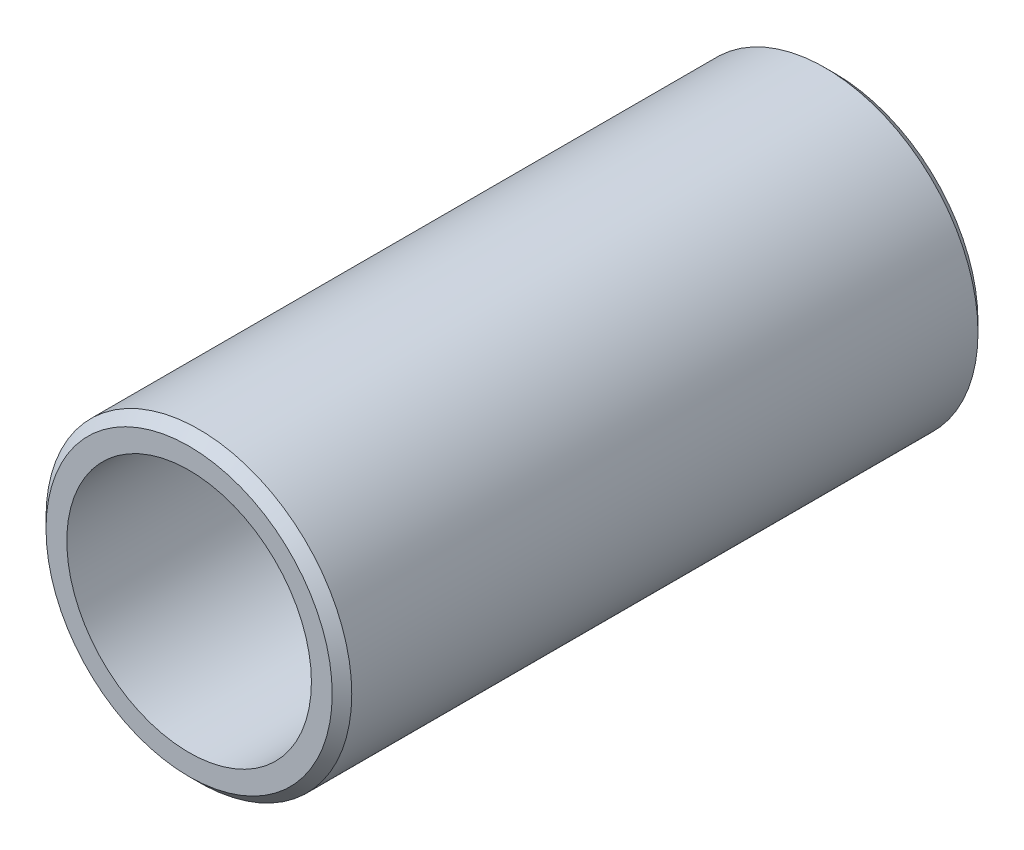
ISO-10303-21;
HEADER;
FILE_DESCRIPTION(('STEP AP214'),'2;1');
FILE_NAME('part.step','',(''),(''),'','','');
FILE_SCHEMA(('AUTOMOTIVE_DESIGN { 1 0 10303 214 1 1 1 1 }'));
ENDSEC;
DATA;
#1=APPLICATION_CONTEXT('core data for automotive mechanical design processes');
#2=APPLICATION_PROTOCOL_DEFINITION('international standard','automotive_design',2000,#1);
#3=PRODUCT_CONTEXT('',#1,'mechanical');
#4=PRODUCT('Part','Part','',(#3));
#5=PRODUCT_RELATED_PRODUCT_CATEGORY('part','',(#4));
#6=PRODUCT_DEFINITION_FORMATION('','',#4);
#7=PRODUCT_DEFINITION_CONTEXT('part definition',#1,'design');
#8=PRODUCT_DEFINITION('design','',#6,#7);
#9=PRODUCT_DEFINITION_SHAPE('','',#8);
#10=(LENGTH_UNIT() NAMED_UNIT(*) SI_UNIT(.MILLI.,.METRE.));
#11=(NAMED_UNIT(*) PLANE_ANGLE_UNIT() SI_UNIT($,.RADIAN.));
#12=(NAMED_UNIT(*) SI_UNIT($,.STERADIAN.) SOLID_ANGLE_UNIT());
#13=UNCERTAINTY_MEASURE_WITH_UNIT(LENGTH_MEASURE(1.E-05),#10,'distance_accuracy_value','');
#14=(GEOMETRIC_REPRESENTATION_CONTEXT(3) GLOBAL_UNCERTAINTY_ASSIGNED_CONTEXT((#13)) GLOBAL_UNIT_ASSIGNED_CONTEXT((#10,
#11,#12)) REPRESENTATION_CONTEXT('',''));
#15=CARTESIAN_POINT('',(0.,0.,0.));
#16=DIRECTION('',(0.,0.,1.));
#17=DIRECTION('',(1.,0.,0.));
#18=AXIS2_PLACEMENT_3D('',#15,#16,#17);
#19=CARTESIAN_POINT('',(0.,0.,33.528));
#20=DIRECTION('',(0.,0.,1.));
#21=DIRECTION('',(1.,0.,0.));
#22=AXIS2_PLACEMENT_3D('',#19,#20,#21);
#23=PLANE('',#22);
#24=CARTESIAN_POINT('',(0.,0.,33.528));
#25=DIRECTION('',(0.,0.,1.));
#26=DIRECTION('',(1.,0.,0.));
#27=AXIS2_PLACEMENT_3D('',#24,#25,#26);
#28=CIRCLE('',#27,7.42950000000001);
#29=CARTESIAN_POINT('',(7.42950000000001,0.,33.528));
#30=VERTEX_POINT('',#29);
#31=EDGE_CURVE('E10',#30,#30,#28,.T.);
#32=ORIENTED_EDGE('',*,*,#31,.T.);
#33=EDGE_LOOP('',(#32));
#34=FACE_BOUND('',#33,.T.);
#35=CARTESIAN_POINT('',(0.,0.,33.528));
#36=DIRECTION('',(0.,0.,1.));
#37=DIRECTION('',(1.,0.,0.));
#38=AXIS2_PLACEMENT_3D('',#35,#36,#37);
#39=CIRCLE('',#38,6.35);
#40=CARTESIAN_POINT('',(6.35,0.,33.528));
#41=VERTEX_POINT('',#40);
#42=EDGE_CURVE('E50',#41,#41,#39,.T.);
#43=ORIENTED_EDGE('',*,*,#42,.F.);
#44=EDGE_LOOP('',(#43));
#45=FACE_BOUND('',#44,.T.);
#46=ADVANCED_FACE('F30',(#34,#45),#23,.T.);
#47=CARTESIAN_POINT('',(0.,0.,0.));
#48=DIRECTION('',(0.,0.,1.));
#49=DIRECTION('',(1.,0.,0.));
#50=AXIS2_PLACEMENT_3D('',#47,#48,#49);
#51=PLANE('',#50);
#52=CARTESIAN_POINT('',(0.,0.,0.));
#53=DIRECTION('',(0.,0.,1.));
#54=DIRECTION('',(1.,0.,0.));
#55=AXIS2_PLACEMENT_3D('',#52,#53,#54);
#56=CIRCLE('',#55,7.4295);
#57=CARTESIAN_POINT('',(7.4295,0.,0.));
#58=VERTEX_POINT('',#57);
#59=EDGE_CURVE('E37',#58,#58,#56,.F.);
#60=ORIENTED_EDGE('',*,*,#59,.T.);
#61=EDGE_LOOP('',(#60));
#62=FACE_BOUND('',#61,.T.);
#63=CARTESIAN_POINT('',(0.,0.,0.));
#64=DIRECTION('',(0.,0.,1.));
#65=DIRECTION('',(1.,0.,0.));
#66=AXIS2_PLACEMENT_3D('',#63,#64,#65);
#67=CIRCLE('',#66,6.35);
#68=CARTESIAN_POINT('',(6.35,0.,0.));
#69=VERTEX_POINT('',#68);
#70=EDGE_CURVE('E51',#69,#69,#67,.T.);
#71=ORIENTED_EDGE('',*,*,#70,.T.);
#72=EDGE_LOOP('',(#71));
#73=FACE_BOUND('',#72,.T.);
#74=ADVANCED_FACE('F61',(#62,#73),#51,.F.);
#75=CARTESIAN_POINT('',(0.,0.,33.528));
#76=DIRECTION('',(0.,0.,-1.));
#77=DIRECTION('',(-1.,0.,0.));
#78=AXIS2_PLACEMENT_3D('',#75,#76,#77);
#79=CYLINDRICAL_SURFACE('',#78,7.9375);
#80=CARTESIAN_POINT('',(0.,0.,0.508000000000002));
#81=DIRECTION('',(0.,0.,1.));
#82=DIRECTION('',(1.,0.,0.));
#83=AXIS2_PLACEMENT_3D('',#80,#81,#82);
#84=CIRCLE('',#83,7.9375);
#85=CARTESIAN_POINT('',(7.9375,0.,0.508000000000002));
#86=VERTEX_POINT('',#85);
#87=EDGE_CURVE('E41',#86,#86,#84,.T.);
#88=ORIENTED_EDGE('',*,*,#87,.T.);
#89=EDGE_LOOP('',(#88));
#90=FACE_BOUND('',#89,.T.);
#91=CARTESIAN_POINT('',(0.,0.,33.02));
#92=DIRECTION('',(0.,0.,1.));
#93=DIRECTION('',(1.,0.,0.));
#94=AXIS2_PLACEMENT_3D('',#91,#92,#93);
#95=CIRCLE('',#94,7.9375);
#96=CARTESIAN_POINT('',(7.9375,0.,33.02));
#97=VERTEX_POINT('',#96);
#98=EDGE_CURVE('E45',#97,#97,#95,.F.);
#99=ORIENTED_EDGE('',*,*,#98,.T.);
#100=EDGE_LOOP('',(#99));
#101=FACE_BOUND('',#100,.T.);
#102=ADVANCED_FACE('F66',(#90,#101),#79,.T.);
#103=CARTESIAN_POINT('',(0.,0.,33.528));
#104=DIRECTION('',(0.,0.,-1.));
#105=DIRECTION('',(-1.,0.,0.));
#106=AXIS2_PLACEMENT_3D('',#103,#104,#105);
#107=CYLINDRICAL_SURFACE('',#106,6.35);
#108=ORIENTED_EDGE('',*,*,#42,.T.);
#109=EDGE_LOOP('',(#108));
#110=FACE_BOUND('',#109,.T.);
#111=ORIENTED_EDGE('',*,*,#70,.F.);
#112=EDGE_LOOP('',(#111));
#113=FACE_BOUND('',#112,.T.);
#114=ADVANCED_FACE('F57',(#110,#113),#107,.F.);
#115=CARTESIAN_POINT('',(0.,0.,0.508000000000002));
#116=DIRECTION('',(0.,0.,1.));
#117=DIRECTION('',(1.,0.,0.));
#118=AXIS2_PLACEMENT_3D('',#115,#116,#117);
#119=CONICAL_SURFACE('',#118,7.9375,0.785398163397452);
#120=ORIENTED_EDGE('',*,*,#59,.F.);
#121=EDGE_LOOP('',(#120));
#122=FACE_BOUND('',#121,.T.);
#123=ORIENTED_EDGE('',*,*,#87,.F.);
#124=EDGE_LOOP('',(#123));
#125=FACE_BOUND('',#124,.T.);
#126=ADVANCED_FACE('F72',(#122,#125),#119,.T.);
#127=CARTESIAN_POINT('',(0.,0.,33.528));
#128=DIRECTION('',(0.,0.,-1.));
#129=DIRECTION('',(-1.,0.,0.));
#130=AXIS2_PLACEMENT_3D('',#127,#128,#129);
#131=CONICAL_SURFACE('',#130,7.42950000000001,0.785398163397445);
#132=ORIENTED_EDGE('',*,*,#98,.F.);
#133=EDGE_LOOP('',(#132));
#134=FACE_BOUND('',#133,.T.);
#135=ORIENTED_EDGE('',*,*,#31,.F.);
#136=EDGE_LOOP('',(#135));
#137=FACE_BOUND('',#136,.T.);
#138=ADVANCED_FACE('F32',(#134,#137),#131,.T.);
#139=CLOSED_SHELL('',(#46,#74,#102,#114,#126,#138));
#140=MANIFOLD_SOLID_BREP('B2',#139);
#141=ADVANCED_BREP_SHAPE_REPRESENTATION('',(#18,#140),#14);
#142=SHAPE_DEFINITION_REPRESENTATION(#9,#141);
ENDSEC;
END-ISO-10303-21;
